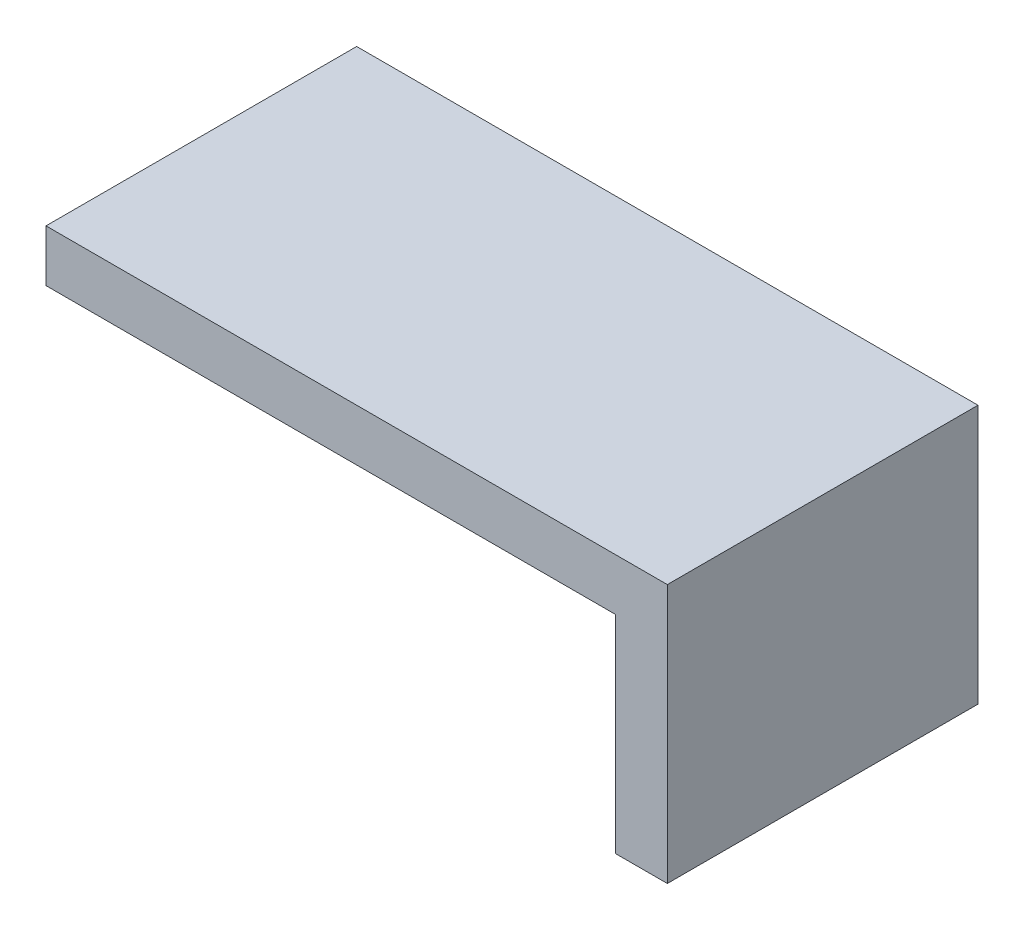
ISO-10303-21;
HEADER;
FILE_DESCRIPTION(('STEP AP214'),'2;1');
FILE_NAME('part.step','',(''),(''),'','','');
FILE_SCHEMA(('AUTOMOTIVE_DESIGN { 1 0 10303 214 1 1 1 1 }'));
ENDSEC;
DATA;
#1=APPLICATION_CONTEXT('core data for automotive mechanical design processes');
#2=APPLICATION_PROTOCOL_DEFINITION('international standard','automotive_design',2000,#1);
#3=PRODUCT_CONTEXT('',#1,'mechanical');
#4=PRODUCT('Part','Part','',(#3));
#5=PRODUCT_RELATED_PRODUCT_CATEGORY('part','',(#4));
#6=PRODUCT_DEFINITION_FORMATION('','',#4);
#7=PRODUCT_DEFINITION_CONTEXT('part definition',#1,'design');
#8=PRODUCT_DEFINITION('design','',#6,#7);
#9=PRODUCT_DEFINITION_SHAPE('','',#8);
#10=(LENGTH_UNIT() NAMED_UNIT(*) SI_UNIT(.MILLI.,.METRE.));
#11=(NAMED_UNIT(*) PLANE_ANGLE_UNIT() SI_UNIT($,.RADIAN.));
#12=(NAMED_UNIT(*) SI_UNIT($,.STERADIAN.) SOLID_ANGLE_UNIT());
#13=UNCERTAINTY_MEASURE_WITH_UNIT(LENGTH_MEASURE(1.E-05),#10,'distance_accuracy_value','');
#14=(GEOMETRIC_REPRESENTATION_CONTEXT(3) GLOBAL_UNCERTAINTY_ASSIGNED_CONTEXT((#13)) GLOBAL_UNIT_ASSIGNED_CONTEXT((#10,
#11,#12)) REPRESENTATION_CONTEXT('',''));
#15=CARTESIAN_POINT('',(0.,0.,0.));
#16=DIRECTION('',(0.,0.,1.));
#17=DIRECTION('',(1.,0.,0.));
#18=AXIS2_PLACEMENT_3D('',#15,#16,#17);
#19=CARTESIAN_POINT('',(0.,5.,0.));
#20=DIRECTION('',(1.,0.,0.));
#21=DIRECTION('',(0.,0.,-1.));
#22=AXIS2_PLACEMENT_3D('',#19,#20,#21);
#23=PLANE('',#22);
#24=DIRECTION('',(0.,0.,1.));
#25=VECTOR('',#24,1.);
#26=CARTESIAN_POINT('',(0.,0.,0.));
#27=LINE('',#26,#25);
#28=CARTESIAN_POINT('',(0.,0.,-30.));
#29=VERTEX_POINT('',#28);
#30=CARTESIAN_POINT('',(0.,0.,0.));
#31=VERTEX_POINT('',#30);
#32=EDGE_CURVE('E121',#29,#31,#27,.T.);
#33=ORIENTED_EDGE('',*,*,#32,.T.);
#34=DIRECTION('',(0.,-1.,0.));
#35=VECTOR('',#34,1.);
#36=CARTESIAN_POINT('',(0.,5.,0.));
#37=LINE('',#36,#35);
#38=CARTESIAN_POINT('',(0.,5.,0.));
#39=VERTEX_POINT('',#38);
#40=EDGE_CURVE('E11',#39,#31,#37,.T.);
#41=ORIENTED_EDGE('',*,*,#40,.F.);
#42=DIRECTION('',(0.,0.,1.));
#43=VECTOR('',#42,1.);
#44=CARTESIAN_POINT('',(0.,5.,0.));
#45=LINE('',#44,#43);
#46=CARTESIAN_POINT('',(0.,5.,-30.));
#47=VERTEX_POINT('',#46);
#48=EDGE_CURVE('E122',#47,#39,#45,.T.);
#49=ORIENTED_EDGE('',*,*,#48,.F.);
#50=DIRECTION('',(0.,-1.,0.));
#51=VECTOR('',#50,1.);
#52=CARTESIAN_POINT('',(0.,5.,-30.));
#53=LINE('',#52,#51);
#54=EDGE_CURVE('E127',#47,#29,#53,.T.);
#55=ORIENTED_EDGE('',*,*,#54,.T.);
#56=EDGE_LOOP('',(#33,#41,#49,#55));
#57=FACE_BOUND('',#56,.T.);
#58=ADVANCED_FACE('F33',(#57),#23,.F.);
#59=CARTESIAN_POINT('',(0.,5.,0.));
#60=DIRECTION('',(0.,0.,-1.));
#61=DIRECTION('',(-1.,0.,0.));
#62=AXIS2_PLACEMENT_3D('',#59,#60,#61);
#63=PLANE('',#62);
#64=DIRECTION('',(1.,0.,0.));
#65=VECTOR('',#64,1.);
#66=CARTESIAN_POINT('',(0.,0.,0.));
#67=LINE('',#66,#65);
#68=CARTESIAN_POINT('',(55.,0.,0.));
#69=VERTEX_POINT('',#68);
#70=EDGE_CURVE('E130',#31,#69,#67,.T.);
#71=ORIENTED_EDGE('',*,*,#70,.T.);
#72=DIRECTION('',(0.,1.,0.));
#73=VECTOR('',#72,1.);
#74=CARTESIAN_POINT('',(55.,-20.,0.));
#75=LINE('',#74,#73);
#76=CARTESIAN_POINT('',(55.,-20.,0.));
#77=VERTEX_POINT('',#76);
#78=EDGE_CURVE('E104',#77,#69,#75,.T.);
#79=ORIENTED_EDGE('',*,*,#78,.F.);
#80=DIRECTION('',(-1.,0.,0.));
#81=VECTOR('',#80,1.);
#82=CARTESIAN_POINT('',(60.,-20.,0.));
#83=LINE('',#82,#81);
#84=CARTESIAN_POINT('',(60.,-20.,0.));
#85=VERTEX_POINT('',#84);
#86=EDGE_CURVE('E101',#85,#77,#83,.T.);
#87=ORIENTED_EDGE('',*,*,#86,.F.);
#88=DIRECTION('',(0.,-1.,0.));
#89=VECTOR('',#88,1.);
#90=CARTESIAN_POINT('',(60.,5.,0.));
#91=LINE('',#90,#89);
#92=CARTESIAN_POINT('',(60.,5.,0.));
#93=VERTEX_POINT('',#92);
#94=EDGE_CURVE('E40',#93,#85,#91,.T.);
#95=ORIENTED_EDGE('',*,*,#94,.F.);
#96=DIRECTION('',(1.,0.,0.));
#97=VECTOR('',#96,1.);
#98=CARTESIAN_POINT('',(0.,5.,0.));
#99=LINE('',#98,#97);
#100=EDGE_CURVE('E76',#39,#93,#99,.T.);
#101=ORIENTED_EDGE('',*,*,#100,.F.);
#102=ORIENTED_EDGE('',*,*,#40,.T.);
#103=EDGE_LOOP('',(#71,#79,#87,#95,#101,#102));
#104=FACE_BOUND('',#103,.T.);
#105=ADVANCED_FACE('F102',(#104),#63,.F.);
#106=CARTESIAN_POINT('',(60.,5.,0.));
#107=DIRECTION('',(-1.,0.,0.));
#108=DIRECTION('',(0.,0.,1.));
#109=AXIS2_PLACEMENT_3D('',#106,#107,#108);
#110=PLANE('',#109);
#111=ORIENTED_EDGE('',*,*,#94,.T.);
#112=DIRECTION('',(0.,0.,1.));
#113=VECTOR('',#112,1.);
#114=CARTESIAN_POINT('',(60.,-20.,0.));
#115=LINE('',#114,#113);
#116=CARTESIAN_POINT('',(60.,-20.,-30.));
#117=VERTEX_POINT('',#116);
#118=EDGE_CURVE('E97',#117,#85,#115,.T.);
#119=ORIENTED_EDGE('',*,*,#118,.F.);
#120=DIRECTION('',(0.,-1.,0.));
#121=VECTOR('',#120,1.);
#122=CARTESIAN_POINT('',(60.,5.,-30.));
#123=LINE('',#122,#121);
#124=CARTESIAN_POINT('',(60.,5.,-30.));
#125=VERTEX_POINT('',#124);
#126=EDGE_CURVE('E99',#125,#117,#123,.T.);
#127=ORIENTED_EDGE('',*,*,#126,.F.);
#128=DIRECTION('',(0.,0.,-1.));
#129=VECTOR('',#128,1.);
#130=CARTESIAN_POINT('',(60.,5.,0.));
#131=LINE('',#130,#129);
#132=EDGE_CURVE('E98',#93,#125,#131,.T.);
#133=ORIENTED_EDGE('',*,*,#132,.F.);
#134=EDGE_LOOP('',(#111,#119,#127,#133));
#135=FACE_BOUND('',#134,.T.);
#136=ADVANCED_FACE('F94',(#135),#110,.F.);
#137=CARTESIAN_POINT('',(0.,5.,-30.));
#138=DIRECTION('',(0.,0.,1.));
#139=DIRECTION('',(1.,0.,0.));
#140=AXIS2_PLACEMENT_3D('',#137,#138,#139);
#141=PLANE('',#140);
#142=ORIENTED_EDGE('',*,*,#126,.T.);
#143=DIRECTION('',(1.,0.,0.));
#144=VECTOR('',#143,1.);
#145=CARTESIAN_POINT('',(60.,-20.,-30.));
#146=LINE('',#145,#144);
#147=CARTESIAN_POINT('',(55.,-20.,-30.));
#148=VERTEX_POINT('',#147);
#149=EDGE_CURVE('E112',#148,#117,#146,.T.);
#150=ORIENTED_EDGE('',*,*,#149,.F.);
#151=DIRECTION('',(0.,1.,0.));
#152=VECTOR('',#151,1.);
#153=CARTESIAN_POINT('',(55.,-20.,-30.));
#154=LINE('',#153,#152);
#155=CARTESIAN_POINT('',(55.,0.,-30.));
#156=VERTEX_POINT('',#155);
#157=EDGE_CURVE('E117',#148,#156,#154,.T.);
#158=ORIENTED_EDGE('',*,*,#157,.T.);
#159=DIRECTION('',(-1.,0.,0.));
#160=VECTOR('',#159,1.);
#161=CARTESIAN_POINT('',(0.,0.,-30.));
#162=LINE('',#161,#160);
#163=EDGE_CURVE('E69',#156,#29,#162,.T.);
#164=ORIENTED_EDGE('',*,*,#163,.T.);
#165=ORIENTED_EDGE('',*,*,#54,.F.);
#166=DIRECTION('',(-1.,0.,0.));
#167=VECTOR('',#166,1.);
#168=CARTESIAN_POINT('',(0.,5.,-30.));
#169=LINE('',#168,#167);
#170=EDGE_CURVE('E56',#125,#47,#169,.T.);
#171=ORIENTED_EDGE('',*,*,#170,.F.);
#172=EDGE_LOOP('',(#142,#150,#158,#164,#165,#171));
#173=FACE_BOUND('',#172,.T.);
#174=ADVANCED_FACE('F134',(#173),#141,.F.);
#175=CARTESIAN_POINT('',(0.,5.,0.));
#176=DIRECTION('',(0.,-1.,0.));
#177=DIRECTION('',(0.,0.,-1.));
#178=AXIS2_PLACEMENT_3D('',#175,#176,#177);
#179=PLANE('',#178);
#180=ORIENTED_EDGE('',*,*,#48,.T.);
#181=ORIENTED_EDGE('',*,*,#100,.T.);
#182=ORIENTED_EDGE('',*,*,#132,.T.);
#183=ORIENTED_EDGE('',*,*,#170,.T.);
#184=EDGE_LOOP('',(#180,#181,#182,#183));
#185=FACE_BOUND('',#184,.T.);
#186=ADVANCED_FACE('F139',(#185),#179,.F.);
#187=CARTESIAN_POINT('',(0.,0.,0.));
#188=DIRECTION('',(0.,-1.,0.));
#189=DIRECTION('',(0.,0.,-1.));
#190=AXIS2_PLACEMENT_3D('',#187,#188,#189);
#191=PLANE('',#190);
#192=DIRECTION('',(0.,0.,-1.));
#193=VECTOR('',#192,1.);
#194=CARTESIAN_POINT('',(55.,0.,0.));
#195=LINE('',#194,#193);
#196=EDGE_CURVE('E47',#69,#156,#195,.T.);
#197=ORIENTED_EDGE('',*,*,#196,.F.);
#198=ORIENTED_EDGE('',*,*,#70,.F.);
#199=ORIENTED_EDGE('',*,*,#32,.F.);
#200=ORIENTED_EDGE('',*,*,#163,.F.);
#201=EDGE_LOOP('',(#197,#198,#199,#200));
#202=FACE_BOUND('',#201,.T.);
#203=ADVANCED_FACE('F141',(#202),#191,.T.);
#204=CARTESIAN_POINT('',(55.,-20.,0.));
#205=DIRECTION('',(1.,0.,0.));
#206=DIRECTION('',(0.,0.,-1.));
#207=AXIS2_PLACEMENT_3D('',#204,#205,#206);
#208=PLANE('',#207);
#209=ORIENTED_EDGE('',*,*,#196,.T.);
#210=ORIENTED_EDGE('',*,*,#157,.F.);
#211=DIRECTION('',(0.,0.,-1.));
#212=VECTOR('',#211,1.);
#213=CARTESIAN_POINT('',(55.,-20.,0.));
#214=LINE('',#213,#212);
#215=EDGE_CURVE('E107',#77,#148,#214,.T.);
#216=ORIENTED_EDGE('',*,*,#215,.F.);
#217=ORIENTED_EDGE('',*,*,#78,.T.);
#218=EDGE_LOOP('',(#209,#210,#216,#217));
#219=FACE_BOUND('',#218,.T.);
#220=ADVANCED_FACE('F147',(#219),#208,.F.);
#221=CARTESIAN_POINT('',(0.,-20.,0.));
#222=DIRECTION('',(0.,1.,0.));
#223=DIRECTION('',(0.,0.,1.));
#224=AXIS2_PLACEMENT_3D('',#221,#222,#223);
#225=PLANE('',#224);
#226=ORIENTED_EDGE('',*,*,#118,.T.);
#227=ORIENTED_EDGE('',*,*,#86,.T.);
#228=ORIENTED_EDGE('',*,*,#215,.T.);
#229=ORIENTED_EDGE('',*,*,#149,.T.);
#230=EDGE_LOOP('',(#226,#227,#228,#229));
#231=FACE_BOUND('',#230,.T.);
#232=ADVANCED_FACE('F110',(#231),#225,.F.);
#233=CLOSED_SHELL('',(#58,#105,#136,#174,#186,#203,#220,#232));
#234=MANIFOLD_SOLID_BREP('B2',#233);
#235=ADVANCED_BREP_SHAPE_REPRESENTATION('',(#18,#234),#14);
#236=SHAPE_DEFINITION_REPRESENTATION(#9,#235);
ENDSEC;
END-ISO-10303-21;
